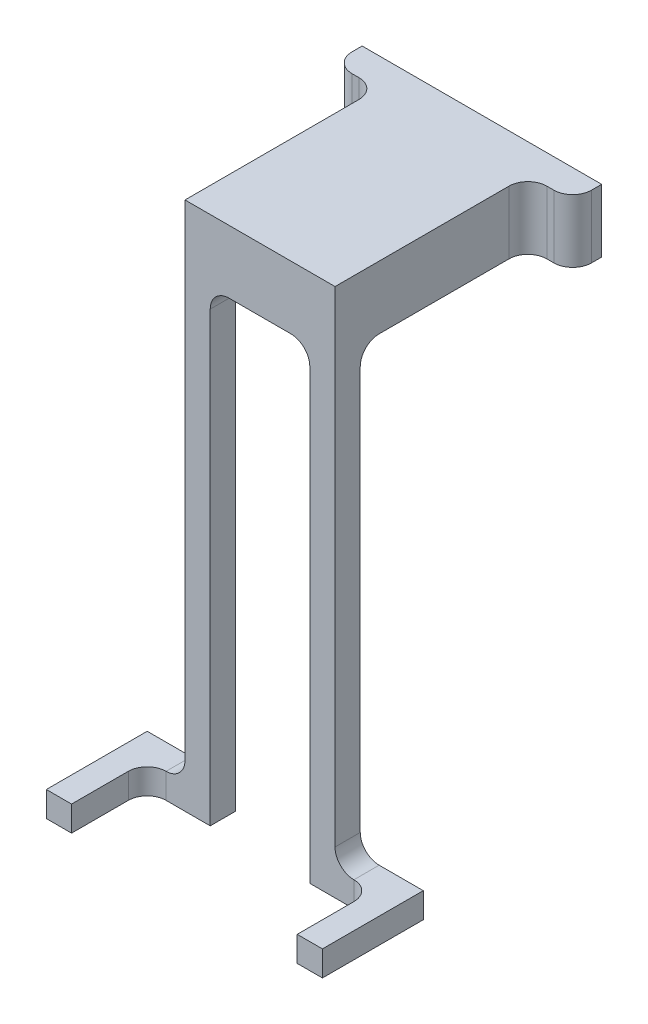
ISO-10303-21;
HEADER;
FILE_DESCRIPTION(('STEP AP214'),'2;1');
FILE_NAME('part.step','',(''),(''),'','','');
FILE_SCHEMA(('AUTOMOTIVE_DESIGN { 1 0 10303 214 1 1 1 1 }'));
ENDSEC;
DATA;
#1=APPLICATION_CONTEXT('core data for automotive mechanical design processes');
#2=APPLICATION_PROTOCOL_DEFINITION('international standard','automotive_design',2000,#1);
#3=PRODUCT_CONTEXT('',#1,'mechanical');
#4=PRODUCT('Part','Part','',(#3));
#5=PRODUCT_RELATED_PRODUCT_CATEGORY('part','',(#4));
#6=PRODUCT_DEFINITION_FORMATION('','',#4);
#7=PRODUCT_DEFINITION_CONTEXT('part definition',#1,'design');
#8=PRODUCT_DEFINITION('design','',#6,#7);
#9=PRODUCT_DEFINITION_SHAPE('','',#8);
#10=(LENGTH_UNIT() NAMED_UNIT(*) SI_UNIT(.MILLI.,.METRE.));
#11=(NAMED_UNIT(*) PLANE_ANGLE_UNIT() SI_UNIT($,.RADIAN.));
#12=(NAMED_UNIT(*) SI_UNIT($,.STERADIAN.) SOLID_ANGLE_UNIT());
#13=UNCERTAINTY_MEASURE_WITH_UNIT(LENGTH_MEASURE(1.E-05),#10,'distance_accuracy_value','');
#14=(GEOMETRIC_REPRESENTATION_CONTEXT(3) GLOBAL_UNCERTAINTY_ASSIGNED_CONTEXT((#13)) GLOBAL_UNIT_ASSIGNED_CONTEXT((#10,
#11,#12)) REPRESENTATION_CONTEXT('',''));
#15=CARTESIAN_POINT('',(0.,0.,0.));
#16=DIRECTION('',(0.,0.,1.));
#17=DIRECTION('',(1.,0.,0.));
#18=AXIS2_PLACEMENT_3D('',#15,#16,#17);
#19=CARTESIAN_POINT('',(-5.95,5.,15.3));
#20=DIRECTION('',(0.,0.,-1.));
#21=DIRECTION('',(-1.,0.,0.));
#22=AXIS2_PLACEMENT_3D('',#19,#20,#21);
#23=PLANE('',#22);
#24=CARTESIAN_POINT('',(-7.45,-33.5,15.3));
#25=DIRECTION('',(0.,0.,-1.));
#26=DIRECTION('',(-1.,0.,0.));
#27=AXIS2_PLACEMENT_3D('',#24,#25,#26);
#28=CIRCLE('',#27,1.5);
#29=CARTESIAN_POINT('',(-5.95,-33.5,15.3));
#30=VERTEX_POINT('',#29);
#31=CARTESIAN_POINT('',(-7.45,-35.,15.3));
#32=VERTEX_POINT('',#31);
#33=EDGE_CURVE('E530',#30,#32,#28,.T.);
#34=ORIENTED_EDGE('',*,*,#33,.T.);
#35=DIRECTION('',(0.,1.,0.));
#36=VECTOR('',#35,1.);
#37=CARTESIAN_POINT('',(-7.45,-37.,15.3));
#38=LINE('',#37,#36);
#39=CARTESIAN_POINT('',(-7.45,-37.,15.3));
#40=VERTEX_POINT('',#39);
#41=EDGE_CURVE('E578',#32,#40,#38,.F.);
#42=ORIENTED_EDGE('',*,*,#41,.T.);
#43=DIRECTION('',(-1.,0.,0.));
#44=VECTOR('',#43,1.);
#45=CARTESIAN_POINT('',(-5.95,-37.,15.3));
#46=LINE('',#45,#44);
#47=CARTESIAN_POINT('',(-3.95,-37.,15.3));
#48=VERTEX_POINT('',#47);
#49=EDGE_CURVE('E358',#48,#40,#46,.T.);
#50=ORIENTED_EDGE('',*,*,#49,.F.);
#51=DIRECTION('',(0.,1.,0.));
#52=VECTOR('',#51,1.);
#53=CARTESIAN_POINT('',(-3.95,-37.,15.3));
#54=LINE('',#53,#52);
#55=CARTESIAN_POINT('',(-3.95,-1.5,15.3));
#56=VERTEX_POINT('',#55);
#57=EDGE_CURVE('E362',#48,#56,#54,.T.);
#58=ORIENTED_EDGE('',*,*,#57,.T.);
#59=CARTESIAN_POINT('',(-2.45,-1.5,15.3));
#60=DIRECTION('',(0.,0.,-1.));
#61=DIRECTION('',(-1.,0.,0.));
#62=AXIS2_PLACEMENT_3D('',#59,#60,#61);
#63=CIRCLE('',#62,1.5);
#64=CARTESIAN_POINT('',(-2.45,0.,15.3));
#65=VERTEX_POINT('',#64);
#66=EDGE_CURVE('E543',#56,#65,#63,.T.);
#67=ORIENTED_EDGE('',*,*,#66,.T.);
#68=DIRECTION('',(1.,0.,0.));
#69=VECTOR('',#68,1.);
#70=CARTESIAN_POINT('',(-5.95,0.,15.3));
#71=LINE('',#70,#69);
#72=CARTESIAN_POINT('',(2.45,0.,15.3));
#73=VERTEX_POINT('',#72);
#74=EDGE_CURVE('E416',#65,#73,#71,.T.);
#75=ORIENTED_EDGE('',*,*,#74,.T.);
#76=CARTESIAN_POINT('',(2.45,-1.5,15.3));
#77=DIRECTION('',(0.,0.,-1.));
#78=DIRECTION('',(-1.,0.,0.));
#79=AXIS2_PLACEMENT_3D('',#76,#77,#78);
#80=CIRCLE('',#79,1.5);
#81=CARTESIAN_POINT('',(3.95,-1.5,15.3));
#82=VERTEX_POINT('',#81);
#83=EDGE_CURVE('E546',#73,#82,#80,.T.);
#84=ORIENTED_EDGE('',*,*,#83,.T.);
#85=DIRECTION('',(0.,1.,0.));
#86=VECTOR('',#85,1.);
#87=CARTESIAN_POINT('',(3.95,-37.,15.3));
#88=LINE('',#87,#86);
#89=CARTESIAN_POINT('',(3.95,-37.,15.3));
#90=VERTEX_POINT('',#89);
#91=EDGE_CURVE('E332',#90,#82,#88,.T.);
#92=ORIENTED_EDGE('',*,*,#91,.F.);
#93=DIRECTION('',(-1.,0.,0.));
#94=VECTOR('',#93,1.);
#95=CARTESIAN_POINT('',(5.95,-37.,15.3));
#96=LINE('',#95,#94);
#97=CARTESIAN_POINT('',(7.45,-37.,15.3));
#98=VERTEX_POINT('',#97);
#99=EDGE_CURVE('E349',#98,#90,#96,.T.);
#100=ORIENTED_EDGE('',*,*,#99,.F.);
#101=DIRECTION('',(0.,-1.,0.));
#102=VECTOR('',#101,1.);
#103=CARTESIAN_POINT('',(7.45,-35.,15.3));
#104=LINE('',#103,#102);
#105=CARTESIAN_POINT('',(7.45,-35.,15.3));
#106=VERTEX_POINT('',#105);
#107=EDGE_CURVE('E575',#98,#106,#104,.F.);
#108=ORIENTED_EDGE('',*,*,#107,.T.);
#109=CARTESIAN_POINT('',(7.45,-33.5,15.3));
#110=DIRECTION('',(0.,0.,-1.));
#111=DIRECTION('',(-1.,0.,0.));
#112=AXIS2_PLACEMENT_3D('',#109,#110,#111);
#113=CIRCLE('',#112,1.5);
#114=CARTESIAN_POINT('',(5.95,-33.5,15.3));
#115=VERTEX_POINT('',#114);
#116=EDGE_CURVE('E534',#106,#115,#113,.T.);
#117=ORIENTED_EDGE('',*,*,#116,.T.);
#118=DIRECTION('',(0.,-1.,0.));
#119=VECTOR('',#118,1.);
#120=CARTESIAN_POINT('',(5.95,5.,15.3));
#121=LINE('',#120,#119);
#122=CARTESIAN_POINT('',(5.95,5.,15.3));
#123=VERTEX_POINT('',#122);
#124=EDGE_CURVE('E440',#123,#115,#121,.T.);
#125=ORIENTED_EDGE('',*,*,#124,.F.);
#126=DIRECTION('',(1.,0.,0.));
#127=VECTOR('',#126,1.);
#128=CARTESIAN_POINT('',(-5.95,5.,15.3));
#129=LINE('',#128,#127);
#130=CARTESIAN_POINT('',(-5.95,5.,15.3));
#131=VERTEX_POINT('',#130);
#132=EDGE_CURVE('E387',#131,#123,#129,.T.);
#133=ORIENTED_EDGE('',*,*,#132,.F.);
#134=DIRECTION('',(0.,-1.,0.));
#135=VECTOR('',#134,1.);
#136=CARTESIAN_POINT('',(-5.95,5.,15.3));
#137=LINE('',#136,#135);
#138=EDGE_CURVE('E444',#131,#30,#137,.T.);
#139=ORIENTED_EDGE('',*,*,#138,.T.);
#140=EDGE_LOOP('',(#34,#42,#50,#58,#67,#75,#84,#92,#100,#108,#117,#125,#133,#139));
#141=FACE_BOUND('',#140,.T.);
#142=ADVANCED_FACE('F44',(#141),#23,.F.);
#143=CARTESIAN_POINT('',(5.95,5.,0.));
#144=DIRECTION('',(-1.,0.,0.));
#145=DIRECTION('',(0.,0.,1.));
#146=AXIS2_PLACEMENT_3D('',#143,#144,#145);
#147=PLANE('',#146);
#148=ORIENTED_EDGE('',*,*,#124,.T.);
#149=DIRECTION('',(0.,0.,1.));
#150=VECTOR('',#149,1.);
#151=CARTESIAN_POINT('',(5.95,-33.5,13.3));
#152=LINE('',#151,#150);
#153=CARTESIAN_POINT('',(5.95,-33.5,13.3));
#154=VERTEX_POINT('',#153);
#155=EDGE_CURVE('E465',#115,#154,#152,.F.);
#156=ORIENTED_EDGE('',*,*,#155,.T.);
#157=DIRECTION('',(0.,1.,0.));
#158=VECTOR('',#157,1.);
#159=CARTESIAN_POINT('',(5.95,-37.,13.3));
#160=LINE('',#159,#158);
#161=CARTESIAN_POINT('',(5.95,-1.5,13.3));
#162=VERTEX_POINT('',#161);
#163=EDGE_CURVE('E340',#154,#162,#160,.T.);
#164=ORIENTED_EDGE('',*,*,#163,.T.);
#165=CARTESIAN_POINT('',(5.95,-1.5,11.8));
#166=DIRECTION('',(-1.,0.,0.));
#167=DIRECTION('',(0.,0.,1.));
#168=AXIS2_PLACEMENT_3D('',#165,#166,#167);
#169=CIRCLE('',#168,1.5);
#170=CARTESIAN_POINT('',(5.95,0.,11.8));
#171=VERTEX_POINT('',#170);
#172=EDGE_CURVE('E549',#162,#171,#169,.T.);
#173=ORIENTED_EDGE('',*,*,#172,.T.);
#174=DIRECTION('',(0.,0.,-1.));
#175=VECTOR('',#174,1.);
#176=CARTESIAN_POINT('',(5.95,0.,0.));
#177=LINE('',#176,#175);
#178=CARTESIAN_POINT('',(5.95,0.,1.5));
#179=VERTEX_POINT('',#178);
#180=EDGE_CURVE('E420',#171,#179,#177,.T.);
#181=ORIENTED_EDGE('',*,*,#180,.T.);
#182=DIRECTION('',(0.,-1.,0.));
#183=VECTOR('',#182,1.);
#184=CARTESIAN_POINT('',(5.95,5.,1.5));
#185=LINE('',#184,#183);
#186=CARTESIAN_POINT('',(5.95,5.,1.5));
#187=VERTEX_POINT('',#186);
#188=EDGE_CURVE('E462',#179,#187,#185,.F.);
#189=ORIENTED_EDGE('',*,*,#188,.T.);
#190=DIRECTION('',(0.,0.,-1.));
#191=VECTOR('',#190,1.);
#192=CARTESIAN_POINT('',(5.95,5.,0.));
#193=LINE('',#192,#191);
#194=EDGE_CURVE('E390',#123,#187,#193,.T.);
#195=ORIENTED_EDGE('',*,*,#194,.F.);
#196=EDGE_LOOP('',(#148,#156,#164,#173,#181,#189,#195));
#197=FACE_BOUND('',#196,.T.);
#198=ADVANCED_FACE('F614',(#197),#147,.F.);
#199=CARTESIAN_POINT('',(-5.95,5.,15.3));
#200=DIRECTION('',(1.,0.,0.));
#201=DIRECTION('',(0.,0.,-1.));
#202=AXIS2_PLACEMENT_3D('',#199,#200,#201);
#203=PLANE('',#202);
#204=DIRECTION('',(0.,1.,0.));
#205=VECTOR('',#204,1.);
#206=CARTESIAN_POINT('',(-5.95,-37.,13.3));
#207=LINE('',#206,#205);
#208=CARTESIAN_POINT('',(-5.95,-33.5,13.3));
#209=VERTEX_POINT('',#208);
#210=CARTESIAN_POINT('',(-5.95,-1.5,13.3));
#211=VERTEX_POINT('',#210);
#212=EDGE_CURVE('E370',#209,#211,#207,.T.);
#213=ORIENTED_EDGE('',*,*,#212,.F.);
#214=DIRECTION('',(0.,0.,-1.));
#215=VECTOR('',#214,1.);
#216=CARTESIAN_POINT('',(-5.95,-33.5,15.3));
#217=LINE('',#216,#215);
#218=EDGE_CURVE('E456',#209,#30,#217,.F.);
#219=ORIENTED_EDGE('',*,*,#218,.T.);
#220=ORIENTED_EDGE('',*,*,#138,.F.);
#221=DIRECTION('',(0.,0.,1.));
#222=VECTOR('',#221,1.);
#223=CARTESIAN_POINT('',(-5.95,5.,15.3));
#224=LINE('',#223,#222);
#225=CARTESIAN_POINT('',(-5.95,5.,1.5));
#226=VERTEX_POINT('',#225);
#227=EDGE_CURVE('E384',#226,#131,#224,.T.);
#228=ORIENTED_EDGE('',*,*,#227,.F.);
#229=DIRECTION('',(0.,-1.,0.));
#230=VECTOR('',#229,1.);
#231=CARTESIAN_POINT('',(-5.95,0.,1.5));
#232=LINE('',#231,#230);
#233=CARTESIAN_POINT('',(-5.95,0.,1.5));
#234=VERTEX_POINT('',#233);
#235=EDGE_CURVE('E452',#226,#234,#232,.T.);
#236=ORIENTED_EDGE('',*,*,#235,.T.);
#237=DIRECTION('',(0.,0.,1.));
#238=VECTOR('',#237,1.);
#239=CARTESIAN_POINT('',(-5.95,0.,15.3));
#240=LINE('',#239,#238);
#241=CARTESIAN_POINT('',(-5.95,0.,11.8));
#242=VERTEX_POINT('',#241);
#243=EDGE_CURVE('E412',#234,#242,#240,.T.);
#244=ORIENTED_EDGE('',*,*,#243,.T.);
#245=CARTESIAN_POINT('',(-5.95,-1.5,11.8));
#246=DIRECTION('',(1.,0.,0.));
#247=DIRECTION('',(0.,0.,-1.));
#248=AXIS2_PLACEMENT_3D('',#245,#246,#247);
#249=CIRCLE('',#248,1.5);
#250=EDGE_CURVE('E540',#242,#211,#249,.T.);
#251=ORIENTED_EDGE('',*,*,#250,.T.);
#252=EDGE_LOOP('',(#213,#219,#220,#228,#236,#244,#251));
#253=FACE_BOUND('',#252,.T.);
#254=ADVANCED_FACE('F667',(#253),#203,.F.);
#255=CARTESIAN_POINT('',(0.,0.,0.));
#256=DIRECTION('',(0.,-1.,0.));
#257=DIRECTION('',(0.,0.,-1.));
#258=AXIS2_PLACEMENT_3D('',#255,#256,#257);
#259=PLANE('',#258);
#260=DIRECTION('',(0.,0.,1.));
#261=VECTOR('',#260,1.);
#262=CARTESIAN_POINT('',(-2.45,0.,0.));
#263=LINE('',#262,#261);
#264=CARTESIAN_POINT('',(-2.45,0.,11.8));
#265=VERTEX_POINT('',#264);
#266=EDGE_CURVE('E484',#65,#265,#263,.F.);
#267=ORIENTED_EDGE('',*,*,#266,.T.);
#268=DIRECTION('',(1.,0.,0.));
#269=VECTOR('',#268,1.);
#270=CARTESIAN_POINT('',(0.,0.,11.8));
#271=LINE('',#270,#269);
#272=EDGE_CURVE('E487',#265,#242,#271,.F.);
#273=ORIENTED_EDGE('',*,*,#272,.T.);
#274=ORIENTED_EDGE('',*,*,#243,.F.);
#275=CARTESIAN_POINT('',(-7.45,0.,1.5));
#276=DIRECTION('',(0.,-1.,0.));
#277=DIRECTION('',(0.,0.,-1.));
#278=AXIS2_PLACEMENT_3D('',#275,#276,#277);
#279=CIRCLE('',#278,1.5);
#280=CARTESIAN_POINT('',(-7.45,0.,0.));
#281=VERTEX_POINT('',#280);
#282=EDGE_CURVE('E552',#234,#281,#279,.F.);
#283=ORIENTED_EDGE('',*,*,#282,.T.);
#284=DIRECTION('',(1.,0.,0.));
#285=VECTOR('',#284,1.);
#286=CARTESIAN_POINT('',(-5.95,0.,0.));
#287=LINE('',#286,#285);
#288=CARTESIAN_POINT('',(-8.,0.,0.));
#289=VERTEX_POINT('',#288);
#290=EDGE_CURVE('E408',#289,#281,#287,.T.);
#291=ORIENTED_EDGE('',*,*,#290,.F.);
#292=CARTESIAN_POINT('',(-8.,0.,-1.5));
#293=DIRECTION('',(0.,-1.,0.));
#294=DIRECTION('',(0.,0.,-1.));
#295=AXIS2_PLACEMENT_3D('',#292,#293,#294);
#296=CIRCLE('',#295,1.5);
#297=CARTESIAN_POINT('',(-9.5,0.,-1.5));
#298=VERTEX_POINT('',#297);
#299=EDGE_CURVE('E475',#289,#298,#296,.T.);
#300=ORIENTED_EDGE('',*,*,#299,.T.);
#301=DIRECTION('',(0.,0.,1.));
#302=VECTOR('',#301,1.);
#303=CARTESIAN_POINT('',(-9.5,0.,-2.3));
#304=LINE('',#303,#302);
#305=CARTESIAN_POINT('',(-9.5,0.,-2.3));
#306=VERTEX_POINT('',#305);
#307=EDGE_CURVE('E374',#306,#298,#304,.T.);
#308=ORIENTED_EDGE('',*,*,#307,.F.);
#309=DIRECTION('',(-1.,0.,0.));
#310=VECTOR('',#309,1.);
#311=CARTESIAN_POINT('',(-9.5,0.,-2.3));
#312=LINE('',#311,#310);
#313=CARTESIAN_POINT('',(9.5,0.,-2.3));
#314=VERTEX_POINT('',#313);
#315=EDGE_CURVE('E380',#314,#306,#312,.T.);
#316=ORIENTED_EDGE('',*,*,#315,.F.);
#317=DIRECTION('',(0.,0.,-1.));
#318=VECTOR('',#317,1.);
#319=CARTESIAN_POINT('',(9.5,0.,-2.3));
#320=LINE('',#319,#318);
#321=CARTESIAN_POINT('',(9.5,0.,-1.5));
#322=VERTEX_POINT('',#321);
#323=EDGE_CURVE('E428',#322,#314,#320,.T.);
#324=ORIENTED_EDGE('',*,*,#323,.F.);
#325=CARTESIAN_POINT('',(8.,0.,-1.5));
#326=DIRECTION('',(0.,-1.,0.));
#327=DIRECTION('',(0.,0.,-1.));
#328=AXIS2_PLACEMENT_3D('',#325,#326,#327);
#329=CIRCLE('',#328,1.5);
#330=CARTESIAN_POINT('',(8.,0.,0.));
#331=VERTEX_POINT('',#330);
#332=EDGE_CURVE('E472',#322,#331,#329,.T.);
#333=ORIENTED_EDGE('',*,*,#332,.T.);
#334=DIRECTION('',(1.,0.,0.));
#335=VECTOR('',#334,1.);
#336=CARTESIAN_POINT('',(9.5,0.,0.));
#337=LINE('',#336,#335);
#338=CARTESIAN_POINT('',(7.45,0.,0.));
#339=VERTEX_POINT('',#338);
#340=EDGE_CURVE('E424',#339,#331,#337,.T.);
#341=ORIENTED_EDGE('',*,*,#340,.F.);
#342=CARTESIAN_POINT('',(7.45,0.,1.5));
#343=DIRECTION('',(0.,-1.,0.));
#344=DIRECTION('',(0.,0.,-1.));
#345=AXIS2_PLACEMENT_3D('',#342,#343,#344);
#346=CIRCLE('',#345,1.5);
#347=EDGE_CURVE('E558',#339,#179,#346,.F.);
#348=ORIENTED_EDGE('',*,*,#347,.T.);
#349=ORIENTED_EDGE('',*,*,#180,.F.);
#350=DIRECTION('',(1.,0.,0.));
#351=VECTOR('',#350,1.);
#352=CARTESIAN_POINT('',(0.,0.,11.8));
#353=LINE('',#352,#351);
#354=CARTESIAN_POINT('',(2.45,0.,11.8));
#355=VERTEX_POINT('',#354);
#356=EDGE_CURVE('E478',#171,#355,#353,.F.);
#357=ORIENTED_EDGE('',*,*,#356,.T.);
#358=DIRECTION('',(0.,0.,-1.));
#359=VECTOR('',#358,1.);
#360=CARTESIAN_POINT('',(2.45,0.,0.));
#361=LINE('',#360,#359);
#362=EDGE_CURVE('E481',#355,#73,#361,.F.);
#363=ORIENTED_EDGE('',*,*,#362,.T.);
#364=ORIENTED_EDGE('',*,*,#74,.F.);
#365=EDGE_LOOP('',(#267,#273,#274,#283,#291,#300,#308,#316,#324,#333,#341,#348,#349,#357,#363,#364));
#366=FACE_BOUND('',#365,.T.);
#367=ADVANCED_FACE('F629',(#366),#259,.T.);
#368=CARTESIAN_POINT('',(-9.5,5.,-2.3));
#369=DIRECTION('',(1.,0.,0.));
#370=DIRECTION('',(0.,0.,-1.));
#371=AXIS2_PLACEMENT_3D('',#368,#369,#370);
#372=PLANE('',#371);
#373=ORIENTED_EDGE('',*,*,#307,.T.);
#374=DIRECTION('',(0.,-1.,0.));
#375=VECTOR('',#374,1.);
#376=CARTESIAN_POINT('',(-9.5,5.,-1.5));
#377=LINE('',#376,#375);
#378=CARTESIAN_POINT('',(-9.5,5.,-1.5));
#379=VERTEX_POINT('',#378);
#380=EDGE_CURVE('E507',#298,#379,#377,.F.);
#381=ORIENTED_EDGE('',*,*,#380,.T.);
#382=DIRECTION('',(0.,0.,1.));
#383=VECTOR('',#382,1.);
#384=CARTESIAN_POINT('',(-9.5,5.,-2.3));
#385=LINE('',#384,#383);
#386=CARTESIAN_POINT('',(-9.5,5.,-2.3));
#387=VERTEX_POINT('',#386);
#388=EDGE_CURVE('E375',#387,#379,#385,.T.);
#389=ORIENTED_EDGE('',*,*,#388,.F.);
#390=DIRECTION('',(0.,-1.,0.));
#391=VECTOR('',#390,1.);
#392=CARTESIAN_POINT('',(-9.5,5.,-2.3));
#393=LINE('',#392,#391);
#394=EDGE_CURVE('E404',#387,#306,#393,.T.);
#395=ORIENTED_EDGE('',*,*,#394,.T.);
#396=EDGE_LOOP('',(#373,#381,#389,#395));
#397=FACE_BOUND('',#396,.T.);
#398=ADVANCED_FACE('F649',(#397),#372,.F.);
#399=CARTESIAN_POINT('',(-5.95,5.,0.));
#400=DIRECTION('',(0.,0.,-1.));
#401=DIRECTION('',(-1.,0.,0.));
#402=AXIS2_PLACEMENT_3D('',#399,#400,#401);
#403=PLANE('',#402);
#404=DIRECTION('',(1.,0.,0.));
#405=VECTOR('',#404,1.);
#406=CARTESIAN_POINT('',(-5.95,5.,0.));
#407=LINE('',#406,#405);
#408=CARTESIAN_POINT('',(-8.,5.,0.));
#409=VERTEX_POINT('',#408);
#410=CARTESIAN_POINT('',(-7.45,5.,0.));
#411=VERTEX_POINT('',#410);
#412=EDGE_CURVE('E379',#409,#411,#407,.T.);
#413=ORIENTED_EDGE('',*,*,#412,.F.);
#414=DIRECTION('',(0.,-1.,0.));
#415=VECTOR('',#414,1.);
#416=CARTESIAN_POINT('',(-8.,5.,0.));
#417=LINE('',#416,#415);
#418=EDGE_CURVE('E503',#409,#289,#417,.T.);
#419=ORIENTED_EDGE('',*,*,#418,.T.);
#420=ORIENTED_EDGE('',*,*,#290,.T.);
#421=DIRECTION('',(0.,-1.,0.));
#422=VECTOR('',#421,1.);
#423=CARTESIAN_POINT('',(-7.45,5.,0.));
#424=LINE('',#423,#422);
#425=EDGE_CURVE('E500',#281,#411,#424,.F.);
#426=ORIENTED_EDGE('',*,*,#425,.T.);
#427=EDGE_LOOP('',(#413,#419,#420,#426));
#428=FACE_BOUND('',#427,.T.);
#429=ADVANCED_FACE('F657',(#428),#403,.F.);
#430=CARTESIAN_POINT('',(9.5,5.,0.));
#431=DIRECTION('',(0.,0.,-1.));
#432=DIRECTION('',(-1.,0.,0.));
#433=AXIS2_PLACEMENT_3D('',#430,#431,#432);
#434=PLANE('',#433);
#435=ORIENTED_EDGE('',*,*,#340,.T.);
#436=DIRECTION('',(0.,-1.,0.));
#437=VECTOR('',#436,1.);
#438=CARTESIAN_POINT('',(8.,5.,0.));
#439=LINE('',#438,#437);
#440=CARTESIAN_POINT('',(8.,5.,0.));
#441=VERTEX_POINT('',#440);
#442=EDGE_CURVE('E524',#331,#441,#439,.F.);
#443=ORIENTED_EDGE('',*,*,#442,.T.);
#444=DIRECTION('',(1.,0.,0.));
#445=VECTOR('',#444,1.);
#446=CARTESIAN_POINT('',(9.5,5.,0.));
#447=LINE('',#446,#445);
#448=CARTESIAN_POINT('',(7.45,5.,0.));
#449=VERTEX_POINT('',#448);
#450=EDGE_CURVE('E394',#449,#441,#447,.T.);
#451=ORIENTED_EDGE('',*,*,#450,.F.);
#452=DIRECTION('',(0.,-1.,0.));
#453=VECTOR('',#452,1.);
#454=CARTESIAN_POINT('',(7.45,0.,0.));
#455=LINE('',#454,#453);
#456=EDGE_CURVE('E520',#449,#339,#455,.T.);
#457=ORIENTED_EDGE('',*,*,#456,.T.);
#458=EDGE_LOOP('',(#435,#443,#451,#457));
#459=FACE_BOUND('',#458,.T.);
#460=ADVANCED_FACE('F626',(#459),#434,.F.);
#461=CARTESIAN_POINT('',(9.5,5.,-2.3));
#462=DIRECTION('',(-1.,0.,0.));
#463=DIRECTION('',(0.,0.,1.));
#464=AXIS2_PLACEMENT_3D('',#461,#462,#463);
#465=PLANE('',#464);
#466=DIRECTION('',(0.,0.,-1.));
#467=VECTOR('',#466,1.);
#468=CARTESIAN_POINT('',(9.5,5.,-2.3));
#469=LINE('',#468,#467);
#470=CARTESIAN_POINT('',(9.5,5.,-1.5));
#471=VERTEX_POINT('',#470);
#472=CARTESIAN_POINT('',(9.5,5.,-2.3));
#473=VERTEX_POINT('',#472);
#474=EDGE_CURVE('E398',#471,#473,#469,.T.);
#475=ORIENTED_EDGE('',*,*,#474,.F.);
#476=DIRECTION('',(0.,-1.,0.));
#477=VECTOR('',#476,1.);
#478=CARTESIAN_POINT('',(9.5,5.,-1.5));
#479=LINE('',#478,#477);
#480=EDGE_CURVE('E516',#471,#322,#479,.T.);
#481=ORIENTED_EDGE('',*,*,#480,.T.);
#482=ORIENTED_EDGE('',*,*,#323,.T.);
#483=DIRECTION('',(0.,-1.,0.));
#484=VECTOR('',#483,1.);
#485=CARTESIAN_POINT('',(9.5,5.,-2.3));
#486=LINE('',#485,#484);
#487=EDGE_CURVE('E436',#473,#314,#486,.T.);
#488=ORIENTED_EDGE('',*,*,#487,.F.);
#489=EDGE_LOOP('',(#475,#481,#482,#488));
#490=FACE_BOUND('',#489,.T.);
#491=ADVANCED_FACE('F639',(#490),#465,.F.);
#492=CARTESIAN_POINT('',(-9.5,5.,-2.3));
#493=DIRECTION('',(0.,0.,1.));
#494=DIRECTION('',(1.,0.,0.));
#495=AXIS2_PLACEMENT_3D('',#492,#493,#494);
#496=PLANE('',#495);
#497=ORIENTED_EDGE('',*,*,#315,.T.);
#498=ORIENTED_EDGE('',*,*,#394,.F.);
#499=DIRECTION('',(-1.,0.,0.));
#500=VECTOR('',#499,1.);
#501=CARTESIAN_POINT('',(-9.5,5.,-2.3));
#502=LINE('',#501,#500);
#503=EDGE_CURVE('E401',#473,#387,#502,.T.);
#504=ORIENTED_EDGE('',*,*,#503,.F.);
#505=ORIENTED_EDGE('',*,*,#487,.T.);
#506=EDGE_LOOP('',(#497,#498,#504,#505));
#507=FACE_BOUND('',#506,.T.);
#508=ADVANCED_FACE('F646',(#507),#496,.F.);
#509=CARTESIAN_POINT('',(0.,5.,0.));
#510=DIRECTION('',(0.,-1.,0.));
#511=DIRECTION('',(0.,0.,-1.));
#512=AXIS2_PLACEMENT_3D('',#509,#510,#511);
#513=PLANE('',#512);
#514=ORIENTED_EDGE('',*,*,#388,.T.);
#515=CARTESIAN_POINT('',(-8.,5.,-1.5));
#516=DIRECTION('',(0.,-1.,0.));
#517=DIRECTION('',(0.,0.,-1.));
#518=AXIS2_PLACEMENT_3D('',#515,#516,#517);
#519=CIRCLE('',#518,1.5);
#520=EDGE_CURVE('E513',#379,#409,#519,.F.);
#521=ORIENTED_EDGE('',*,*,#520,.T.);
#522=ORIENTED_EDGE('',*,*,#412,.T.);
#523=CARTESIAN_POINT('',(-7.45,5.,1.5));
#524=DIRECTION('',(0.,-1.,0.));
#525=DIRECTION('',(0.,0.,-1.));
#526=AXIS2_PLACEMENT_3D('',#523,#524,#525);
#527=CIRCLE('',#526,1.5);
#528=EDGE_CURVE('E555',#411,#226,#527,.T.);
#529=ORIENTED_EDGE('',*,*,#528,.T.);
#530=ORIENTED_EDGE('',*,*,#227,.T.);
#531=ORIENTED_EDGE('',*,*,#132,.T.);
#532=ORIENTED_EDGE('',*,*,#194,.T.);
#533=CARTESIAN_POINT('',(7.45,5.,1.5));
#534=DIRECTION('',(0.,-1.,0.));
#535=DIRECTION('',(0.,0.,-1.));
#536=AXIS2_PLACEMENT_3D('',#533,#534,#535);
#537=CIRCLE('',#536,1.5);
#538=EDGE_CURVE('E561',#187,#449,#537,.T.);
#539=ORIENTED_EDGE('',*,*,#538,.T.);
#540=ORIENTED_EDGE('',*,*,#450,.T.);
#541=CARTESIAN_POINT('',(8.,5.,-1.5));
#542=DIRECTION('',(0.,-1.,0.));
#543=DIRECTION('',(0.,0.,-1.));
#544=AXIS2_PLACEMENT_3D('',#541,#542,#543);
#545=CIRCLE('',#544,1.5);
#546=EDGE_CURVE('E510',#441,#471,#545,.F.);
#547=ORIENTED_EDGE('',*,*,#546,.T.);
#548=ORIENTED_EDGE('',*,*,#474,.T.);
#549=ORIENTED_EDGE('',*,*,#503,.T.);
#550=EDGE_LOOP('',(#514,#521,#522,#529,#530,#531,#532,#539,#540,#547,#548,#549));
#551=FACE_BOUND('',#550,.T.);
#552=ADVANCED_FACE('F619',(#551),#513,.F.);
#553=CARTESIAN_POINT('',(-5.95,-37.,13.3));
#554=DIRECTION('',(0.,0.,1.));
#555=DIRECTION('',(1.,0.,0.));
#556=AXIS2_PLACEMENT_3D('',#553,#554,#555);
#557=PLANE('',#556);
#558=ORIENTED_EDGE('',*,*,#212,.T.);
#559=DIRECTION('',(1.,0.,0.));
#560=VECTOR('',#559,1.);
#561=CARTESIAN_POINT('',(-5.95,-1.5,13.3));
#562=LINE('',#561,#560);
#563=CARTESIAN_POINT('',(-3.95,-1.5,13.3));
#564=VERTEX_POINT('',#563);
#565=EDGE_CURVE('E468',#211,#564,#562,.T.);
#566=ORIENTED_EDGE('',*,*,#565,.T.);
#567=DIRECTION('',(0.,1.,0.));
#568=VECTOR('',#567,1.);
#569=CARTESIAN_POINT('',(-3.95,-37.,13.3));
#570=LINE('',#569,#568);
#571=CARTESIAN_POINT('',(-3.95,-37.,13.3));
#572=VERTEX_POINT('',#571);
#573=EDGE_CURVE('E366',#572,#564,#570,.T.);
#574=ORIENTED_EDGE('',*,*,#573,.F.);
#575=DIRECTION('',(1.,0.,0.));
#576=VECTOR('',#575,1.);
#577=CARTESIAN_POINT('',(-5.95,-37.,13.3));
#578=LINE('',#577,#576);
#579=CARTESIAN_POINT('',(-10.95,-37.,13.3));
#580=VERTEX_POINT('',#579);
#581=EDGE_CURVE('E352',#580,#572,#578,.T.);
#582=ORIENTED_EDGE('',*,*,#581,.F.);
#583=DIRECTION('',(0.,-1.,0.));
#584=VECTOR('',#583,1.);
#585=CARTESIAN_POINT('',(-10.95,-37.,13.3));
#586=LINE('',#585,#584);
#587=CARTESIAN_POINT('',(-10.95,-35.,13.3));
#588=VERTEX_POINT('',#587);
#589=EDGE_CURVE('E318',#588,#580,#586,.T.);
#590=ORIENTED_EDGE('',*,*,#589,.F.);
#591=DIRECTION('',(1.,0.,0.));
#592=VECTOR('',#591,1.);
#593=CARTESIAN_POINT('',(-10.95,-35.,13.3));
#594=LINE('',#593,#592);
#595=CARTESIAN_POINT('',(-7.45,-35.,13.3));
#596=VERTEX_POINT('',#595);
#597=EDGE_CURVE('E328',#588,#596,#594,.T.);
#598=ORIENTED_EDGE('',*,*,#597,.T.);
#599=CARTESIAN_POINT('',(-7.45,-33.5,13.3));
#600=DIRECTION('',(0.,0.,1.));
#601=DIRECTION('',(1.,0.,0.));
#602=AXIS2_PLACEMENT_3D('',#599,#600,#601);
#603=CIRCLE('',#602,1.5);
#604=EDGE_CURVE('E527',#596,#209,#603,.T.);
#605=ORIENTED_EDGE('',*,*,#604,.T.);
#606=EDGE_LOOP('',(#558,#566,#574,#582,#590,#598,#605));
#607=FACE_BOUND('',#606,.T.);
#608=ADVANCED_FACE('F704',(#607),#557,.F.);
#609=CARTESIAN_POINT('',(-3.95,-37.,15.3));
#610=DIRECTION('',(-1.,0.,0.));
#611=DIRECTION('',(0.,0.,1.));
#612=AXIS2_PLACEMENT_3D('',#609,#610,#611);
#613=PLANE('',#612);
#614=ORIENTED_EDGE('',*,*,#573,.T.);
#615=DIRECTION('',(0.,0.,1.));
#616=VECTOR('',#615,1.);
#617=CARTESIAN_POINT('',(-3.95,-1.5,15.3));
#618=LINE('',#617,#616);
#619=EDGE_CURVE('E490',#564,#56,#618,.T.);
#620=ORIENTED_EDGE('',*,*,#619,.T.);
#621=ORIENTED_EDGE('',*,*,#57,.F.);
#622=DIRECTION('',(0.,0.,1.));
#623=VECTOR('',#622,1.);
#624=CARTESIAN_POINT('',(-3.95,-37.,15.3));
#625=LINE('',#624,#623);
#626=EDGE_CURVE('E355',#572,#48,#625,.T.);
#627=ORIENTED_EDGE('',*,*,#626,.F.);
#628=EDGE_LOOP('',(#614,#620,#621,#627));
#629=FACE_BOUND('',#628,.T.);
#630=ADVANCED_FACE('F690',(#629),#613,.F.);
#631=CARTESIAN_POINT('',(0.,-37.,0.));
#632=DIRECTION('',(0.,-1.,0.));
#633=DIRECTION('',(0.,0.,-1.));
#634=AXIS2_PLACEMENT_3D('',#631,#632,#633);
#635=PLANE('',#634);
#636=ORIENTED_EDGE('',*,*,#49,.T.);
#637=CARTESIAN_POINT('',(-7.45,-37.,16.8));
#638=DIRECTION('',(0.,-1.,0.));
#639=DIRECTION('',(0.,0.,-1.));
#640=AXIS2_PLACEMENT_3D('',#637,#638,#639);
#641=CIRCLE('',#640,1.5);
#642=CARTESIAN_POINT('',(-8.95,-37.,16.8));
#643=VERTEX_POINT('',#642);
#644=EDGE_CURVE('E587',#40,#643,#641,.F.);
#645=ORIENTED_EDGE('',*,*,#644,.T.);
#646=DIRECTION('',(0.,0.,-1.));
#647=VECTOR('',#646,1.);
#648=CARTESIAN_POINT('',(-8.95,-37.,21.3));
#649=LINE('',#648,#647);
#650=CARTESIAN_POINT('',(-8.95,-37.,21.3));
#651=VERTEX_POINT('',#650);
#652=EDGE_CURVE('E266',#651,#643,#649,.T.);
#653=ORIENTED_EDGE('',*,*,#652,.F.);
#654=DIRECTION('',(1.,0.,0.));
#655=VECTOR('',#654,1.);
#656=CARTESIAN_POINT('',(-10.95,-37.,21.3));
#657=LINE('',#656,#655);
#658=CARTESIAN_POINT('',(-10.95,-37.,21.3));
#659=VERTEX_POINT('',#658);
#660=EDGE_CURVE('E289',#659,#651,#657,.T.);
#661=ORIENTED_EDGE('',*,*,#660,.F.);
#662=DIRECTION('',(0.,0.,1.));
#663=VECTOR('',#662,1.);
#664=CARTESIAN_POINT('',(-10.95,-37.,13.3));
#665=LINE('',#664,#663);
#666=EDGE_CURVE('E322',#580,#659,#665,.T.);
#667=ORIENTED_EDGE('',*,*,#666,.F.);
#668=ORIENTED_EDGE('',*,*,#581,.T.);
#669=ORIENTED_EDGE('',*,*,#626,.T.);
#670=EDGE_LOOP('',(#636,#645,#653,#661,#667,#668,#669));
#671=FACE_BOUND('',#670,.T.);
#672=ADVANCED_FACE('F683',(#671),#635,.T.);
#673=CARTESIAN_POINT('',(3.95,-37.,15.3));
#674=DIRECTION('',(1.,0.,0.));
#675=DIRECTION('',(0.,0.,-1.));
#676=AXIS2_PLACEMENT_3D('',#673,#674,#675);
#677=PLANE('',#676);
#678=ORIENTED_EDGE('',*,*,#91,.T.);
#679=DIRECTION('',(0.,0.,-1.));
#680=VECTOR('',#679,1.);
#681=CARTESIAN_POINT('',(3.95,-1.5,15.3));
#682=LINE('',#681,#680);
#683=CARTESIAN_POINT('',(3.95,-1.5,13.3));
#684=VERTEX_POINT('',#683);
#685=EDGE_CURVE('E493',#82,#684,#682,.T.);
#686=ORIENTED_EDGE('',*,*,#685,.T.);
#687=DIRECTION('',(0.,1.,0.));
#688=VECTOR('',#687,1.);
#689=CARTESIAN_POINT('',(3.95,-37.,13.3));
#690=LINE('',#689,#688);
#691=CARTESIAN_POINT('',(3.95,-37.,13.3));
#692=VERTEX_POINT('',#691);
#693=EDGE_CURVE('E336',#692,#684,#690,.T.);
#694=ORIENTED_EDGE('',*,*,#693,.F.);
#695=DIRECTION('',(0.,0.,-1.));
#696=VECTOR('',#695,1.);
#697=CARTESIAN_POINT('',(3.95,-37.,15.3));
#698=LINE('',#697,#696);
#699=EDGE_CURVE('E346',#90,#692,#698,.T.);
#700=ORIENTED_EDGE('',*,*,#699,.F.);
#701=EDGE_LOOP('',(#678,#686,#694,#700));
#702=FACE_BOUND('',#701,.T.);
#703=ADVANCED_FACE('F923',(#702),#677,.F.);
#704=CARTESIAN_POINT('',(5.95,-37.,13.3));
#705=DIRECTION('',(0.,0.,1.));
#706=DIRECTION('',(1.,0.,0.));
#707=AXIS2_PLACEMENT_3D('',#704,#705,#706);
#708=PLANE('',#707);
#709=ORIENTED_EDGE('',*,*,#693,.T.);
#710=DIRECTION('',(1.,0.,0.));
#711=VECTOR('',#710,1.);
#712=CARTESIAN_POINT('',(5.95,-1.5,13.3));
#713=LINE('',#712,#711);
#714=EDGE_CURVE('E497',#684,#162,#713,.T.);
#715=ORIENTED_EDGE('',*,*,#714,.T.);
#716=ORIENTED_EDGE('',*,*,#163,.F.);
#717=CARTESIAN_POINT('',(7.45,-33.5,13.3));
#718=DIRECTION('',(0.,0.,1.));
#719=DIRECTION('',(1.,0.,0.));
#720=AXIS2_PLACEMENT_3D('',#717,#718,#719);
#721=CIRCLE('',#720,1.5);
#722=CARTESIAN_POINT('',(7.45,-35.,13.3));
#723=VERTEX_POINT('',#722);
#724=EDGE_CURVE('E537',#154,#723,#721,.T.);
#725=ORIENTED_EDGE('',*,*,#724,.T.);
#726=DIRECTION('',(-1.,0.,0.));
#727=VECTOR('',#726,1.);
#728=CARTESIAN_POINT('',(10.95,-35.,13.3));
#729=LINE('',#728,#727);
#730=CARTESIAN_POINT('',(10.95,-35.,13.3));
#731=VERTEX_POINT('',#730);
#732=EDGE_CURVE('E314',#731,#723,#729,.T.);
#733=ORIENTED_EDGE('',*,*,#732,.F.);
#734=DIRECTION('',(0.,1.,0.));
#735=VECTOR('',#734,1.);
#736=CARTESIAN_POINT('',(10.95,-37.,13.3));
#737=LINE('',#736,#735);
#738=CARTESIAN_POINT('',(10.95,-37.,13.3));
#739=VERTEX_POINT('',#738);
#740=EDGE_CURVE('E265',#739,#731,#737,.T.);
#741=ORIENTED_EDGE('',*,*,#740,.F.);
#742=DIRECTION('',(1.,0.,0.));
#743=VECTOR('',#742,1.);
#744=CARTESIAN_POINT('',(5.95,-37.,13.3));
#745=LINE('',#744,#743);
#746=EDGE_CURVE('E260',#692,#739,#745,.T.);
#747=ORIENTED_EDGE('',*,*,#746,.F.);
#748=EDGE_LOOP('',(#709,#715,#716,#725,#733,#741,#747));
#749=FACE_BOUND('',#748,.T.);
#750=ADVANCED_FACE('F914',(#749),#708,.F.);
#751=CARTESIAN_POINT('',(0.,-37.,0.));
#752=DIRECTION('',(0.,1.,0.));
#753=DIRECTION('',(0.,0.,1.));
#754=AXIS2_PLACEMENT_3D('',#751,#752,#753);
#755=PLANE('',#754);
#756=ORIENTED_EDGE('',*,*,#746,.T.);
#757=DIRECTION('',(0.,0.,-1.));
#758=VECTOR('',#757,1.);
#759=CARTESIAN_POINT('',(10.95,-37.,15.3));
#760=LINE('',#759,#758);
#761=CARTESIAN_POINT('',(10.95,-37.,21.3));
#762=VERTEX_POINT('',#761);
#763=EDGE_CURVE('E254',#762,#739,#760,.T.);
#764=ORIENTED_EDGE('',*,*,#763,.F.);
#765=DIRECTION('',(1.,0.,0.));
#766=VECTOR('',#765,1.);
#767=CARTESIAN_POINT('',(10.95,-37.,21.3));
#768=LINE('',#767,#766);
#769=CARTESIAN_POINT('',(8.95,-37.,21.3));
#770=VERTEX_POINT('',#769);
#771=EDGE_CURVE('E258',#770,#762,#768,.T.);
#772=ORIENTED_EDGE('',*,*,#771,.F.);
#773=DIRECTION('',(0.,0.,-1.));
#774=VECTOR('',#773,1.);
#775=CARTESIAN_POINT('',(8.95,-37.,21.3));
#776=LINE('',#775,#774);
#777=CARTESIAN_POINT('',(8.95,-37.,16.8));
#778=VERTEX_POINT('',#777);
#779=EDGE_CURVE('E276',#770,#778,#776,.T.);
#780=ORIENTED_EDGE('',*,*,#779,.T.);
#781=CARTESIAN_POINT('',(7.45,-37.,16.8));
#782=DIRECTION('',(0.,1.,0.));
#783=DIRECTION('',(0.,0.,1.));
#784=AXIS2_PLACEMENT_3D('',#781,#782,#783);
#785=CIRCLE('',#784,1.5);
#786=EDGE_CURVE('E53',#778,#98,#785,.T.);
#787=ORIENTED_EDGE('',*,*,#786,.T.);
#788=ORIENTED_EDGE('',*,*,#99,.T.);
#789=ORIENTED_EDGE('',*,*,#699,.T.);
#790=EDGE_LOOP('',(#756,#764,#772,#780,#787,#788,#789));
#791=FACE_BOUND('',#790,.T.);
#792=ADVANCED_FACE('F256',(#791),#755,.F.);
#793=CARTESIAN_POINT('',(-10.95,-35.,13.3));
#794=DIRECTION('',(0.,-1.,0.));
#795=DIRECTION('',(0.,0.,-1.));
#796=AXIS2_PLACEMENT_3D('',#793,#794,#795);
#797=PLANE('',#796);
#798=DIRECTION('',(0.,0.,-1.));
#799=VECTOR('',#798,1.);
#800=CARTESIAN_POINT('',(-8.95,-35.,21.3));
#801=LINE('',#800,#799);
#802=CARTESIAN_POINT('',(-8.95,-35.,21.3));
#803=VERTEX_POINT('',#802);
#804=CARTESIAN_POINT('',(-8.95,-35.,16.8));
#805=VERTEX_POINT('',#804);
#806=EDGE_CURVE('E303',#803,#805,#801,.T.);
#807=ORIENTED_EDGE('',*,*,#806,.T.);
#808=CARTESIAN_POINT('',(-7.45,-35.,16.8));
#809=DIRECTION('',(0.,-1.,0.));
#810=DIRECTION('',(0.,0.,-1.));
#811=AXIS2_PLACEMENT_3D('',#808,#809,#810);
#812=CIRCLE('',#811,1.5);
#813=EDGE_CURVE('E584',#805,#32,#812,.T.);
#814=ORIENTED_EDGE('',*,*,#813,.T.);
#815=DIRECTION('',(0.,0.,-1.));
#816=VECTOR('',#815,1.);
#817=CARTESIAN_POINT('',(-7.45,-35.,13.3));
#818=LINE('',#817,#816);
#819=EDGE_CURVE('E448',#32,#596,#818,.T.);
#820=ORIENTED_EDGE('',*,*,#819,.T.);
#821=ORIENTED_EDGE('',*,*,#597,.F.);
#822=DIRECTION('',(0.,0.,-1.));
#823=VECTOR('',#822,1.);
#824=CARTESIAN_POINT('',(-10.95,-35.,13.3));
#825=LINE('',#824,#823);
#826=CARTESIAN_POINT('',(-10.95,-35.,21.3));
#827=VERTEX_POINT('',#826);
#828=EDGE_CURVE('E325',#827,#588,#825,.T.);
#829=ORIENTED_EDGE('',*,*,#828,.F.);
#830=DIRECTION('',(-1.,0.,0.));
#831=VECTOR('',#830,1.);
#832=CARTESIAN_POINT('',(-10.95,-35.,21.3));
#833=LINE('',#832,#831);
#834=EDGE_CURVE('E299',#803,#827,#833,.T.);
#835=ORIENTED_EDGE('',*,*,#834,.F.);
#836=EDGE_LOOP('',(#807,#814,#820,#821,#829,#835));
#837=FACE_BOUND('',#836,.T.);
#838=ADVANCED_FACE('F706',(#837),#797,.F.);
#839=CARTESIAN_POINT('',(-10.95,0.,0.));
#840=DIRECTION('',(1.,0.,0.));
#841=DIRECTION('',(0.,0.,-1.));
#842=AXIS2_PLACEMENT_3D('',#839,#840,#841);
#843=PLANE('',#842);
#844=ORIENTED_EDGE('',*,*,#589,.T.);
#845=ORIENTED_EDGE('',*,*,#666,.T.);
#846=DIRECTION('',(0.,-1.,0.));
#847=VECTOR('',#846,1.);
#848=CARTESIAN_POINT('',(-10.95,-35.,21.3));
#849=LINE('',#848,#847);
#850=EDGE_CURVE('E283',#827,#659,#849,.T.);
#851=ORIENTED_EDGE('',*,*,#850,.F.);
#852=ORIENTED_EDGE('',*,*,#828,.T.);
#853=EDGE_LOOP('',(#844,#845,#851,#852));
#854=FACE_BOUND('',#853,.T.);
#855=ADVANCED_FACE('F714',(#854),#843,.F.);
#856=CARTESIAN_POINT('',(10.95,-35.,15.3));
#857=DIRECTION('',(0.,-1.,0.));
#858=DIRECTION('',(0.,0.,-1.));
#859=AXIS2_PLACEMENT_3D('',#856,#857,#858);
#860=PLANE('',#859);
#861=ORIENTED_EDGE('',*,*,#732,.T.);
#862=DIRECTION('',(0.,0.,1.));
#863=VECTOR('',#862,1.);
#864=CARTESIAN_POINT('',(7.45,-35.,15.3));
#865=LINE('',#864,#863);
#866=EDGE_CURVE('E459',#723,#106,#865,.T.);
#867=ORIENTED_EDGE('',*,*,#866,.T.);
#868=CARTESIAN_POINT('',(7.45,-35.,16.8));
#869=DIRECTION('',(0.,-1.,0.));
#870=DIRECTION('',(0.,0.,-1.));
#871=AXIS2_PLACEMENT_3D('',#868,#869,#870);
#872=CIRCLE('',#871,1.5);
#873=CARTESIAN_POINT('',(8.95,-35.,16.8));
#874=VERTEX_POINT('',#873);
#875=EDGE_CURVE('E11',#106,#874,#872,.T.);
#876=ORIENTED_EDGE('',*,*,#875,.T.);
#877=DIRECTION('',(0.,0.,-1.));
#878=VECTOR('',#877,1.);
#879=CARTESIAN_POINT('',(8.95,-35.,21.3));
#880=LINE('',#879,#878);
#881=CARTESIAN_POINT('',(8.95,-35.,21.3));
#882=VERTEX_POINT('',#881);
#883=EDGE_CURVE('E568',#882,#874,#880,.T.);
#884=ORIENTED_EDGE('',*,*,#883,.F.);
#885=DIRECTION('',(-1.,0.,0.));
#886=VECTOR('',#885,1.);
#887=CARTESIAN_POINT('',(10.95,-35.,21.3));
#888=LINE('',#887,#886);
#889=CARTESIAN_POINT('',(10.95,-35.,21.3));
#890=VERTEX_POINT('',#889);
#891=EDGE_CURVE('E284',#890,#882,#888,.T.);
#892=ORIENTED_EDGE('',*,*,#891,.F.);
#893=DIRECTION('',(0.,0.,1.));
#894=VECTOR('',#893,1.);
#895=CARTESIAN_POINT('',(10.95,-35.,15.3));
#896=LINE('',#895,#894);
#897=EDGE_CURVE('E280',#731,#890,#896,.T.);
#898=ORIENTED_EDGE('',*,*,#897,.F.);
#899=EDGE_LOOP('',(#861,#867,#876,#884,#892,#898));
#900=FACE_BOUND('',#899,.T.);
#901=ADVANCED_FACE('F602',(#900),#860,.F.);
#902=CARTESIAN_POINT('',(10.95,0.,0.));
#903=DIRECTION('',(-1.,0.,0.));
#904=DIRECTION('',(0.,0.,1.));
#905=AXIS2_PLACEMENT_3D('',#902,#903,#904);
#906=PLANE('',#905);
#907=ORIENTED_EDGE('',*,*,#897,.T.);
#908=DIRECTION('',(0.,1.,0.));
#909=VECTOR('',#908,1.);
#910=CARTESIAN_POINT('',(10.95,-35.,21.3));
#911=LINE('',#910,#909);
#912=EDGE_CURVE('E271',#762,#890,#911,.T.);
#913=ORIENTED_EDGE('',*,*,#912,.F.);
#914=ORIENTED_EDGE('',*,*,#763,.T.);
#915=ORIENTED_EDGE('',*,*,#740,.T.);
#916=EDGE_LOOP('',(#907,#913,#914,#915));
#917=FACE_BOUND('',#916,.T.);
#918=ADVANCED_FACE('F278',(#917),#906,.F.);
#919=CARTESIAN_POINT('',(-8.95,-35.,21.3));
#920=DIRECTION('',(-1.,0.,0.));
#921=DIRECTION('',(0.,0.,1.));
#922=AXIS2_PLACEMENT_3D('',#919,#920,#921);
#923=PLANE('',#922);
#924=ORIENTED_EDGE('',*,*,#652,.T.);
#925=DIRECTION('',(0.,1.,0.));
#926=VECTOR('',#925,1.);
#927=CARTESIAN_POINT('',(-8.95,-35.,16.8));
#928=LINE('',#927,#926);
#929=EDGE_CURVE('E564',#643,#805,#928,.T.);
#930=ORIENTED_EDGE('',*,*,#929,.T.);
#931=ORIENTED_EDGE('',*,*,#806,.F.);
#932=DIRECTION('',(0.,1.,0.));
#933=VECTOR('',#932,1.);
#934=CARTESIAN_POINT('',(-8.95,-35.,21.3));
#935=LINE('',#934,#933);
#936=EDGE_CURVE('E296',#651,#803,#935,.T.);
#937=ORIENTED_EDGE('',*,*,#936,.F.);
#938=EDGE_LOOP('',(#924,#930,#931,#937));
#939=FACE_BOUND('',#938,.T.);
#940=ADVANCED_FACE('F717',(#939),#923,.F.);
#941=CARTESIAN_POINT('',(0.,0.,21.3));
#942=DIRECTION('',(0.,0.,1.));
#943=DIRECTION('',(1.,0.,0.));
#944=AXIS2_PLACEMENT_3D('',#941,#942,#943);
#945=PLANE('',#944);
#946=ORIENTED_EDGE('',*,*,#850,.T.);
#947=ORIENTED_EDGE('',*,*,#660,.T.);
#948=ORIENTED_EDGE('',*,*,#936,.T.);
#949=ORIENTED_EDGE('',*,*,#834,.T.);
#950=EDGE_LOOP('',(#946,#947,#948,#949));
#951=FACE_BOUND('',#950,.T.);
#952=ADVANCED_FACE('F711',(#951),#945,.T.);
#953=CARTESIAN_POINT('',(8.95,-35.,21.3));
#954=DIRECTION('',(1.,0.,0.));
#955=DIRECTION('',(0.,1.,0.));
#956=AXIS2_PLACEMENT_3D('',#953,#954,#955);
#957=PLANE('',#956);
#958=ORIENTED_EDGE('',*,*,#883,.T.);
#959=DIRECTION('',(0.,-1.,0.));
#960=VECTOR('',#959,1.);
#961=CARTESIAN_POINT('',(8.95,-37.,16.8));
#962=LINE('',#961,#960);
#963=EDGE_CURVE('E581',#874,#778,#962,.T.);
#964=ORIENTED_EDGE('',*,*,#963,.T.);
#965=ORIENTED_EDGE('',*,*,#779,.F.);
#966=DIRECTION('',(0.,-1.,0.));
#967=VECTOR('',#966,1.);
#968=CARTESIAN_POINT('',(8.95,-35.,21.3));
#969=LINE('',#968,#967);
#970=EDGE_CURVE('E273',#882,#770,#969,.T.);
#971=ORIENTED_EDGE('',*,*,#970,.F.);
#972=EDGE_LOOP('',(#958,#964,#965,#971));
#973=FACE_BOUND('',#972,.T.);
#974=ADVANCED_FACE('F596',(#973),#957,.F.);
#975=CARTESIAN_POINT('',(0.,0.,21.3));
#976=DIRECTION('',(0.,0.,-1.));
#977=DIRECTION('',(-1.,0.,0.));
#978=AXIS2_PLACEMENT_3D('',#975,#976,#977);
#979=PLANE('',#978);
#980=ORIENTED_EDGE('',*,*,#912,.T.);
#981=ORIENTED_EDGE('',*,*,#891,.T.);
#982=ORIENTED_EDGE('',*,*,#970,.T.);
#983=ORIENTED_EDGE('',*,*,#771,.T.);
#984=EDGE_LOOP('',(#980,#981,#982,#983));
#985=FACE_BOUND('',#984,.T.);
#986=ADVANCED_FACE('F270',(#985),#979,.F.);
#987=CARTESIAN_POINT('',(-7.45,-33.5,13.3));
#988=DIRECTION('',(0.,0.,1.));
#989=DIRECTION('',(1.,0.,0.));
#990=AXIS2_PLACEMENT_3D('',#987,#988,#989);
#991=CYLINDRICAL_SURFACE('',#990,1.5);
#992=ORIENTED_EDGE('',*,*,#33,.F.);
#993=ORIENTED_EDGE('',*,*,#218,.F.);
#994=ORIENTED_EDGE('',*,*,#604,.F.);
#995=ORIENTED_EDGE('',*,*,#819,.F.);
#996=EDGE_LOOP('',(#992,#993,#994,#995));
#997=FACE_BOUND('',#996,.T.);
#998=ADVANCED_FACE('F673',(#997),#991,.F.);
#999=CARTESIAN_POINT('',(7.45,-33.5,15.3));
#1000=DIRECTION('',(0.,0.,-1.));
#1001=DIRECTION('',(-1.,0.,0.));
#1002=AXIS2_PLACEMENT_3D('',#999,#1000,#1001);
#1003=CYLINDRICAL_SURFACE('',#1002,1.5);
#1004=ORIENTED_EDGE('',*,*,#724,.F.);
#1005=ORIENTED_EDGE('',*,*,#155,.F.);
#1006=ORIENTED_EDGE('',*,*,#116,.F.);
#1007=ORIENTED_EDGE('',*,*,#866,.F.);
#1008=EDGE_LOOP('',(#1004,#1005,#1006,#1007));
#1009=FACE_BOUND('',#1008,.T.);
#1010=ADVANCED_FACE('F608',(#1009),#1003,.F.);
#1011=CARTESIAN_POINT('',(-2.45,-1.5,15.3));
#1012=DIRECTION('',(0.,0.,1.));
#1013=DIRECTION('',(1.,0.,0.));
#1014=AXIS2_PLACEMENT_3D('',#1011,#1012,#1013);
#1015=CYLINDRICAL_SURFACE('',#1014,1.5);
#1016=ORIENTED_EDGE('',*,*,#66,.F.);
#1017=ORIENTED_EDGE('',*,*,#619,.F.);
#1018=CARTESIAN_POINT('',(-2.45,-1.5,11.8));
#1019=DIRECTION('',(0.707106781186547,0.,0.707106781186547));
#1020=DIRECTION('',(-0.707106781186547,0.,0.707106781186547));
#1021=AXIS2_PLACEMENT_3D('',#1018,#1019,#1020);
#1022=ELLIPSE('',#1021,2.12132034355964,1.5);
#1023=EDGE_CURVE('E565',#265,#564,#1022,.T.);
#1024=ORIENTED_EDGE('',*,*,#1023,.F.);
#1025=ORIENTED_EDGE('',*,*,#266,.F.);
#1026=EDGE_LOOP('',(#1016,#1017,#1024,#1025));
#1027=FACE_BOUND('',#1026,.T.);
#1028=ADVANCED_FACE('F696',(#1027),#1015,.F.);
#1029=CARTESIAN_POINT('',(-5.95,-1.5,11.8));
#1030=DIRECTION('',(1.,0.,0.));
#1031=DIRECTION('',(0.,0.,-1.));
#1032=AXIS2_PLACEMENT_3D('',#1029,#1030,#1031);
#1033=CYLINDRICAL_SURFACE('',#1032,1.5);
#1034=ORIENTED_EDGE('',*,*,#250,.F.);
#1035=ORIENTED_EDGE('',*,*,#272,.F.);
#1036=ORIENTED_EDGE('',*,*,#1023,.T.);
#1037=ORIENTED_EDGE('',*,*,#565,.F.);
#1038=EDGE_LOOP('',(#1034,#1035,#1036,#1037));
#1039=FACE_BOUND('',#1038,.T.);
#1040=ADVANCED_FACE('F701',(#1039),#1033,.F.);
#1041=CARTESIAN_POINT('',(5.95,-1.5,11.8));
#1042=DIRECTION('',(1.,0.,0.));
#1043=DIRECTION('',(0.,0.,-1.));
#1044=AXIS2_PLACEMENT_3D('',#1041,#1042,#1043);
#1045=CYLINDRICAL_SURFACE('',#1044,1.5);
#1046=ORIENTED_EDGE('',*,*,#172,.F.);
#1047=ORIENTED_EDGE('',*,*,#714,.F.);
#1048=CARTESIAN_POINT('',(2.45,-1.5,11.8));
#1049=DIRECTION('',(0.707106781186547,0.,-0.707106781186547));
#1050=DIRECTION('',(0.707106781186547,0.,0.707106781186547));
#1051=AXIS2_PLACEMENT_3D('',#1048,#1049,#1050);
#1052=ELLIPSE('',#1051,2.12132034355964,1.5);
#1053=EDGE_CURVE('E569',#355,#684,#1052,.T.);
#1054=ORIENTED_EDGE('',*,*,#1053,.F.);
#1055=ORIENTED_EDGE('',*,*,#356,.F.);
#1056=EDGE_LOOP('',(#1046,#1047,#1054,#1055));
#1057=FACE_BOUND('',#1056,.T.);
#1058=ADVANCED_FACE('F750',(#1057),#1045,.F.);
#1059=CARTESIAN_POINT('',(2.45,-1.5,15.3));
#1060=DIRECTION('',(0.,0.,-1.));
#1061=DIRECTION('',(-1.,0.,0.));
#1062=AXIS2_PLACEMENT_3D('',#1059,#1060,#1061);
#1063=CYLINDRICAL_SURFACE('',#1062,1.5);
#1064=ORIENTED_EDGE('',*,*,#83,.F.);
#1065=ORIENTED_EDGE('',*,*,#362,.F.);
#1066=ORIENTED_EDGE('',*,*,#1053,.T.);
#1067=ORIENTED_EDGE('',*,*,#685,.F.);
#1068=EDGE_LOOP('',(#1064,#1065,#1066,#1067));
#1069=FACE_BOUND('',#1068,.T.);
#1070=ADVANCED_FACE('F753',(#1069),#1063,.F.);
#1071=CARTESIAN_POINT('',(-8.,5.,-1.5));
#1072=DIRECTION('',(0.,-1.,0.));
#1073=DIRECTION('',(0.,0.,-1.));
#1074=AXIS2_PLACEMENT_3D('',#1071,#1072,#1073);
#1075=CYLINDRICAL_SURFACE('',#1074,1.5);
#1076=ORIENTED_EDGE('',*,*,#520,.F.);
#1077=ORIENTED_EDGE('',*,*,#380,.F.);
#1078=ORIENTED_EDGE('',*,*,#299,.F.);
#1079=ORIENTED_EDGE('',*,*,#418,.F.);
#1080=EDGE_LOOP('',(#1076,#1077,#1078,#1079));
#1081=FACE_BOUND('',#1080,.T.);
#1082=ADVANCED_FACE('F652',(#1081),#1075,.T.);
#1083=CARTESIAN_POINT('',(-7.45,5.,1.5));
#1084=DIRECTION('',(0.,1.,0.));
#1085=DIRECTION('',(0.,0.,1.));
#1086=AXIS2_PLACEMENT_3D('',#1083,#1084,#1085);
#1087=CYLINDRICAL_SURFACE('',#1086,1.5);
#1088=ORIENTED_EDGE('',*,*,#528,.F.);
#1089=ORIENTED_EDGE('',*,*,#425,.F.);
#1090=ORIENTED_EDGE('',*,*,#282,.F.);
#1091=ORIENTED_EDGE('',*,*,#235,.F.);
#1092=EDGE_LOOP('',(#1088,#1089,#1090,#1091));
#1093=FACE_BOUND('',#1092,.T.);
#1094=ADVANCED_FACE('F661',(#1093),#1087,.F.);
#1095=CARTESIAN_POINT('',(8.,5.,-1.5));
#1096=DIRECTION('',(0.,-1.,0.));
#1097=DIRECTION('',(0.,0.,-1.));
#1098=AXIS2_PLACEMENT_3D('',#1095,#1096,#1097);
#1099=CYLINDRICAL_SURFACE('',#1098,1.5);
#1100=ORIENTED_EDGE('',*,*,#546,.F.);
#1101=ORIENTED_EDGE('',*,*,#442,.F.);
#1102=ORIENTED_EDGE('',*,*,#332,.F.);
#1103=ORIENTED_EDGE('',*,*,#480,.F.);
#1104=EDGE_LOOP('',(#1100,#1101,#1102,#1103));
#1105=FACE_BOUND('',#1104,.T.);
#1106=ADVANCED_FACE('F636',(#1105),#1099,.T.);
#1107=CARTESIAN_POINT('',(7.45,5.,1.5));
#1108=DIRECTION('',(0.,1.,0.));
#1109=DIRECTION('',(0.,0.,1.));
#1110=AXIS2_PLACEMENT_3D('',#1107,#1108,#1109);
#1111=CYLINDRICAL_SURFACE('',#1110,1.5);
#1112=ORIENTED_EDGE('',*,*,#538,.F.);
#1113=ORIENTED_EDGE('',*,*,#188,.F.);
#1114=ORIENTED_EDGE('',*,*,#347,.F.);
#1115=ORIENTED_EDGE('',*,*,#456,.F.);
#1116=EDGE_LOOP('',(#1112,#1113,#1114,#1115));
#1117=FACE_BOUND('',#1116,.T.);
#1118=ADVANCED_FACE('F623',(#1117),#1111,.F.);
#1119=CARTESIAN_POINT('',(-7.45,-35.,16.8));
#1120=DIRECTION('',(0.,-1.,0.));
#1121=DIRECTION('',(0.,0.,-1.));
#1122=AXIS2_PLACEMENT_3D('',#1119,#1120,#1121);
#1123=CYLINDRICAL_SURFACE('',#1122,1.5);
#1124=ORIENTED_EDGE('',*,*,#644,.F.);
#1125=ORIENTED_EDGE('',*,*,#41,.F.);
#1126=ORIENTED_EDGE('',*,*,#813,.F.);
#1127=ORIENTED_EDGE('',*,*,#929,.F.);
#1128=EDGE_LOOP('',(#1124,#1125,#1126,#1127));
#1129=FACE_BOUND('',#1128,.T.);
#1130=ADVANCED_FACE('F679',(#1129),#1123,.F.);
#1131=CARTESIAN_POINT('',(7.45,-35.,16.8));
#1132=DIRECTION('',(0.,1.,0.));
#1133=DIRECTION('',(-1.,0.,0.));
#1134=AXIS2_PLACEMENT_3D('',#1131,#1132,#1133);
#1135=CYLINDRICAL_SURFACE('',#1134,1.5);
#1136=ORIENTED_EDGE('',*,*,#875,.F.);
#1137=ORIENTED_EDGE('',*,*,#107,.F.);
#1138=ORIENTED_EDGE('',*,*,#786,.F.);
#1139=ORIENTED_EDGE('',*,*,#963,.F.);
#1140=EDGE_LOOP('',(#1136,#1137,#1138,#1139));
#1141=FACE_BOUND('',#1140,.T.);
#1142=ADVANCED_FACE('F46',(#1141),#1135,.F.);
#1143=CLOSED_SHELL('',(#142,#198,#254,#367,#398,#429,#460,#491,#508,#552,#608,#630,#672,#703,
#750,#792,#838,#855,#901,#918,#940,#952,#974,#986,#998,#1010,#1028,#1040,#1058,#1070,#1082,
#1094,#1106,#1118,#1130,#1142));
#1144=MANIFOLD_SOLID_BREP('B2',#1143);
#1145=ADVANCED_BREP_SHAPE_REPRESENTATION('',(#18,#1144),#14);
#1146=SHAPE_DEFINITION_REPRESENTATION(#9,#1145);
ENDSEC;
END-ISO-10303-21;
